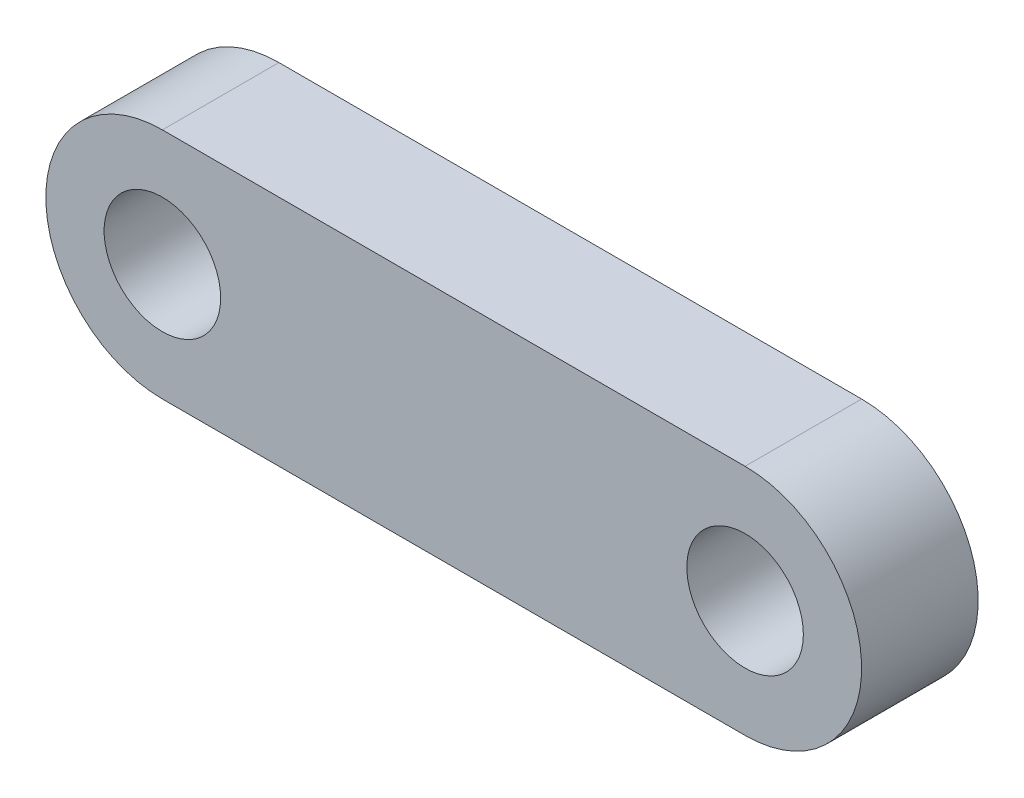
ISO-10303-21;
HEADER;
FILE_DESCRIPTION(('STEP AP214'),'2;1');
FILE_NAME('part.step','',(''),(''),'','','');
FILE_SCHEMA(('AUTOMOTIVE_DESIGN { 1 0 10303 214 1 1 1 1 }'));
ENDSEC;
DATA;
#1=APPLICATION_CONTEXT('core data for automotive mechanical design processes');
#2=APPLICATION_PROTOCOL_DEFINITION('international standard','automotive_design',2000,#1);
#3=PRODUCT_CONTEXT('',#1,'mechanical');
#4=PRODUCT('Part','Part','',(#3));
#5=PRODUCT_RELATED_PRODUCT_CATEGORY('part','',(#4));
#6=PRODUCT_DEFINITION_FORMATION('','',#4);
#7=PRODUCT_DEFINITION_CONTEXT('part definition',#1,'design');
#8=PRODUCT_DEFINITION('design','',#6,#7);
#9=PRODUCT_DEFINITION_SHAPE('','',#8);
#10=(LENGTH_UNIT() NAMED_UNIT(*) SI_UNIT(.MILLI.,.METRE.));
#11=(NAMED_UNIT(*) PLANE_ANGLE_UNIT() SI_UNIT($,.RADIAN.));
#12=(NAMED_UNIT(*) SI_UNIT($,.STERADIAN.) SOLID_ANGLE_UNIT());
#13=UNCERTAINTY_MEASURE_WITH_UNIT(LENGTH_MEASURE(1.E-05),#10,'distance_accuracy_value','');
#14=(GEOMETRIC_REPRESENTATION_CONTEXT(3) GLOBAL_UNCERTAINTY_ASSIGNED_CONTEXT((#13)) GLOBAL_UNIT_ASSIGNED_CONTEXT((#10,
#11,#12)) REPRESENTATION_CONTEXT('',''));
#15=CARTESIAN_POINT('',(0.,0.,0.));
#16=DIRECTION('',(0.,0.,1.));
#17=DIRECTION('',(1.,0.,0.));
#18=AXIS2_PLACEMENT_3D('',#15,#16,#17);
#19=CARTESIAN_POINT('',(-25.,0.,5.));
#20=DIRECTION('',(0.,0.,1.));
#21=DIRECTION('',(1.,0.,0.));
#22=AXIS2_PLACEMENT_3D('',#19,#20,#21);
#23=PLANE('',#22);
#24=CARTESIAN_POINT('',(-25.,0.,5.));
#25=DIRECTION('',(0.,0.,1.));
#26=DIRECTION('',(1.,0.,0.));
#27=AXIS2_PLACEMENT_3D('',#24,#25,#26);
#28=CIRCLE('',#27,5.);
#29=CARTESIAN_POINT('',(-20.,0.,5.));
#30=VERTEX_POINT('',#29);
#31=EDGE_CURVE('E100',#30,#30,#28,.T.);
#32=ORIENTED_EDGE('',*,*,#31,.F.);
#33=EDGE_LOOP('',(#32));
#34=FACE_BOUND('',#33,.T.);
#35=CARTESIAN_POINT('',(-25.,0.,5.));
#36=DIRECTION('',(0.,0.,1.));
#37=DIRECTION('',(1.,0.,0.));
#38=AXIS2_PLACEMENT_3D('',#35,#36,#37);
#39=CIRCLE('',#38,10.);
#40=CARTESIAN_POINT('',(-25.,10.,5.));
#41=VERTEX_POINT('',#40);
#42=CARTESIAN_POINT('',(-25.,-10.,5.));
#43=VERTEX_POINT('',#42);
#44=EDGE_CURVE('E85',#41,#43,#39,.T.);
#45=ORIENTED_EDGE('',*,*,#44,.T.);
#46=DIRECTION('',(1.,0.,0.));
#47=VECTOR('',#46,1.);
#48=CARTESIAN_POINT('',(-25.,-10.,5.));
#49=LINE('',#48,#47);
#50=CARTESIAN_POINT('',(25.,-10.,5.));
#51=VERTEX_POINT('',#50);
#52=EDGE_CURVE('E80',#43,#51,#49,.T.);
#53=ORIENTED_EDGE('',*,*,#52,.T.);
#54=CARTESIAN_POINT('',(25.,0.,5.));
#55=DIRECTION('',(0.,0.,1.));
#56=DIRECTION('',(1.,0.,0.));
#57=AXIS2_PLACEMENT_3D('',#54,#55,#56);
#58=CIRCLE('',#57,10.);
#59=CARTESIAN_POINT('',(25.,10.,5.));
#60=VERTEX_POINT('',#59);
#61=EDGE_CURVE('E83',#51,#60,#58,.T.);
#62=ORIENTED_EDGE('',*,*,#61,.T.);
#63=DIRECTION('',(-1.,0.,0.));
#64=VECTOR('',#63,1.);
#65=CARTESIAN_POINT('',(-25.,10.,5.));
#66=LINE('',#65,#64);
#67=EDGE_CURVE('E50',#60,#41,#66,.T.);
#68=ORIENTED_EDGE('',*,*,#67,.T.);
#69=EDGE_LOOP('',(#45,#53,#62,#68));
#70=FACE_BOUND('',#69,.T.);
#71=CARTESIAN_POINT('',(25.,0.,5.));
#72=DIRECTION('',(0.,0.,1.));
#73=DIRECTION('',(1.,0.,0.));
#74=AXIS2_PLACEMENT_3D('',#71,#72,#73);
#75=CIRCLE('',#74,5.);
#76=CARTESIAN_POINT('',(30.,0.,5.));
#77=VERTEX_POINT('',#76);
#78=EDGE_CURVE('E115',#77,#77,#75,.T.);
#79=ORIENTED_EDGE('',*,*,#78,.F.);
#80=EDGE_LOOP('',(#79));
#81=FACE_BOUND('',#80,.T.);
#82=ADVANCED_FACE('F33',(#34,#70,#81),#23,.T.);
#83=CARTESIAN_POINT('',(-25.,0.,-5.));
#84=DIRECTION('',(0.,0.,1.));
#85=DIRECTION('',(1.,0.,0.));
#86=AXIS2_PLACEMENT_3D('',#83,#84,#85);
#87=PLANE('',#86);
#88=CARTESIAN_POINT('',(-25.,0.,-5.));
#89=DIRECTION('',(0.,0.,1.));
#90=DIRECTION('',(1.,0.,0.));
#91=AXIS2_PLACEMENT_3D('',#88,#89,#90);
#92=CIRCLE('',#91,5.);
#93=CARTESIAN_POINT('',(-20.,0.,-5.));
#94=VERTEX_POINT('',#93);
#95=EDGE_CURVE('E112',#94,#94,#92,.T.);
#96=ORIENTED_EDGE('',*,*,#95,.T.);
#97=EDGE_LOOP('',(#96));
#98=FACE_BOUND('',#97,.T.);
#99=CARTESIAN_POINT('',(-25.,0.,-5.));
#100=DIRECTION('',(0.,0.,1.));
#101=DIRECTION('',(1.,0.,0.));
#102=AXIS2_PLACEMENT_3D('',#99,#100,#101);
#103=CIRCLE('',#102,10.);
#104=CARTESIAN_POINT('',(-25.,10.,-5.));
#105=VERTEX_POINT('',#104);
#106=CARTESIAN_POINT('',(-25.,-10.,-5.));
#107=VERTEX_POINT('',#106);
#108=EDGE_CURVE('E97',#105,#107,#103,.T.);
#109=ORIENTED_EDGE('',*,*,#108,.F.);
#110=DIRECTION('',(-1.,0.,0.));
#111=VECTOR('',#110,1.);
#112=CARTESIAN_POINT('',(-25.,10.,-5.));
#113=LINE('',#112,#111);
#114=CARTESIAN_POINT('',(25.,10.,-5.));
#115=VERTEX_POINT('',#114);
#116=EDGE_CURVE('E73',#115,#105,#113,.T.);
#117=ORIENTED_EDGE('',*,*,#116,.F.);
#118=CARTESIAN_POINT('',(25.,0.,-5.));
#119=DIRECTION('',(0.,0.,1.));
#120=DIRECTION('',(1.,0.,0.));
#121=AXIS2_PLACEMENT_3D('',#118,#119,#120);
#122=CIRCLE('',#121,10.);
#123=CARTESIAN_POINT('',(25.,-10.,-5.));
#124=VERTEX_POINT('',#123);
#125=EDGE_CURVE('E67',#124,#115,#122,.T.);
#126=ORIENTED_EDGE('',*,*,#125,.F.);
#127=DIRECTION('',(1.,0.,0.));
#128=VECTOR('',#127,1.);
#129=CARTESIAN_POINT('',(-25.,-10.,-5.));
#130=LINE('',#129,#128);
#131=EDGE_CURVE('E89',#107,#124,#130,.T.);
#132=ORIENTED_EDGE('',*,*,#131,.F.);
#133=EDGE_LOOP('',(#109,#117,#126,#132));
#134=FACE_BOUND('',#133,.T.);
#135=CARTESIAN_POINT('',(25.,0.,-5.));
#136=DIRECTION('',(0.,0.,1.));
#137=DIRECTION('',(1.,0.,0.));
#138=AXIS2_PLACEMENT_3D('',#135,#136,#137);
#139=CIRCLE('',#138,5.);
#140=CARTESIAN_POINT('',(30.,0.,-5.));
#141=VERTEX_POINT('',#140);
#142=EDGE_CURVE('E118',#141,#141,#139,.T.);
#143=ORIENTED_EDGE('',*,*,#142,.T.);
#144=EDGE_LOOP('',(#143));
#145=FACE_BOUND('',#144,.T.);
#146=ADVANCED_FACE('F108',(#98,#134,#145),#87,.F.);
#147=CARTESIAN_POINT('',(-25.,0.,5.));
#148=DIRECTION('',(0.,0.,-1.));
#149=DIRECTION('',(-1.,0.,0.));
#150=AXIS2_PLACEMENT_3D('',#147,#148,#149);
#151=CYLINDRICAL_SURFACE('',#150,10.);
#152=ORIENTED_EDGE('',*,*,#108,.T.);
#153=DIRECTION('',(0.,0.,-1.));
#154=VECTOR('',#153,1.);
#155=CARTESIAN_POINT('',(-25.,-10.,5.));
#156=LINE('',#155,#154);
#157=EDGE_CURVE('E11',#43,#107,#156,.T.);
#158=ORIENTED_EDGE('',*,*,#157,.F.);
#159=ORIENTED_EDGE('',*,*,#44,.F.);
#160=DIRECTION('',(0.,0.,-1.));
#161=VECTOR('',#160,1.);
#162=CARTESIAN_POINT('',(-25.,10.,5.));
#163=LINE('',#162,#161);
#164=EDGE_CURVE('E93',#41,#105,#163,.T.);
#165=ORIENTED_EDGE('',*,*,#164,.T.);
#166=EDGE_LOOP('',(#152,#158,#159,#165));
#167=FACE_BOUND('',#166,.T.);
#168=ADVANCED_FACE('F35',(#167),#151,.T.);
#169=CARTESIAN_POINT('',(-25.,-10.,5.));
#170=DIRECTION('',(0.,1.,0.));
#171=DIRECTION('',(0.,0.,1.));
#172=AXIS2_PLACEMENT_3D('',#169,#170,#171);
#173=PLANE('',#172);
#174=ORIENTED_EDGE('',*,*,#131,.T.);
#175=DIRECTION('',(0.,0.,-1.));
#176=VECTOR('',#175,1.);
#177=CARTESIAN_POINT('',(25.,-10.,5.));
#178=LINE('',#177,#176);
#179=EDGE_CURVE('E42',#51,#124,#178,.T.);
#180=ORIENTED_EDGE('',*,*,#179,.F.);
#181=ORIENTED_EDGE('',*,*,#52,.F.);
#182=ORIENTED_EDGE('',*,*,#157,.T.);
#183=EDGE_LOOP('',(#174,#180,#181,#182));
#184=FACE_BOUND('',#183,.T.);
#185=ADVANCED_FACE('F88',(#184),#173,.F.);
#186=CARTESIAN_POINT('',(25.,0.,5.));
#187=DIRECTION('',(0.,0.,-1.));
#188=DIRECTION('',(-1.,0.,0.));
#189=AXIS2_PLACEMENT_3D('',#186,#187,#188);
#190=CYLINDRICAL_SURFACE('',#189,10.);
#191=ORIENTED_EDGE('',*,*,#125,.T.);
#192=DIRECTION('',(0.,0.,-1.));
#193=VECTOR('',#192,1.);
#194=CARTESIAN_POINT('',(25.,10.,5.));
#195=LINE('',#194,#193);
#196=EDGE_CURVE('E90',#60,#115,#195,.T.);
#197=ORIENTED_EDGE('',*,*,#196,.F.);
#198=ORIENTED_EDGE('',*,*,#61,.F.);
#199=ORIENTED_EDGE('',*,*,#179,.T.);
#200=EDGE_LOOP('',(#191,#197,#198,#199));
#201=FACE_BOUND('',#200,.T.);
#202=ADVANCED_FACE('F91',(#201),#190,.T.);
#203=CARTESIAN_POINT('',(-25.,10.,5.));
#204=DIRECTION('',(0.,-1.,0.));
#205=DIRECTION('',(0.,0.,-1.));
#206=AXIS2_PLACEMENT_3D('',#203,#204,#205);
#207=PLANE('',#206);
#208=ORIENTED_EDGE('',*,*,#116,.T.);
#209=ORIENTED_EDGE('',*,*,#164,.F.);
#210=ORIENTED_EDGE('',*,*,#67,.F.);
#211=ORIENTED_EDGE('',*,*,#196,.T.);
#212=EDGE_LOOP('',(#208,#209,#210,#211));
#213=FACE_BOUND('',#212,.T.);
#214=ADVANCED_FACE('F105',(#213),#207,.F.);
#215=CARTESIAN_POINT('',(-25.,0.,5.));
#216=DIRECTION('',(0.,0.,-1.));
#217=DIRECTION('',(-1.,0.,0.));
#218=AXIS2_PLACEMENT_3D('',#215,#216,#217);
#219=CYLINDRICAL_SURFACE('',#218,5.);
#220=ORIENTED_EDGE('',*,*,#31,.T.);
#221=EDGE_LOOP('',(#220));
#222=FACE_BOUND('',#221,.T.);
#223=ORIENTED_EDGE('',*,*,#95,.F.);
#224=EDGE_LOOP('',(#223));
#225=FACE_BOUND('',#224,.T.);
#226=ADVANCED_FACE('F136',(#222,#225),#219,.F.);
#227=CARTESIAN_POINT('',(25.,0.,5.));
#228=DIRECTION('',(0.,0.,-1.));
#229=DIRECTION('',(-1.,0.,0.));
#230=AXIS2_PLACEMENT_3D('',#227,#228,#229);
#231=CYLINDRICAL_SURFACE('',#230,5.);
#232=ORIENTED_EDGE('',*,*,#78,.T.);
#233=EDGE_LOOP('',(#232));
#234=FACE_BOUND('',#233,.T.);
#235=ORIENTED_EDGE('',*,*,#142,.F.);
#236=EDGE_LOOP('',(#235));
#237=FACE_BOUND('',#236,.T.);
#238=ADVANCED_FACE('F124',(#234,#237),#231,.F.);
#239=CLOSED_SHELL('',(#82,#146,#168,#185,#202,#214,#226,#238));
#240=MANIFOLD_SOLID_BREP('B2',#239);
#241=ADVANCED_BREP_SHAPE_REPRESENTATION('',(#18,#240),#14);
#242=SHAPE_DEFINITION_REPRESENTATION(#9,#241);
ENDSEC;
END-ISO-10303-21;
